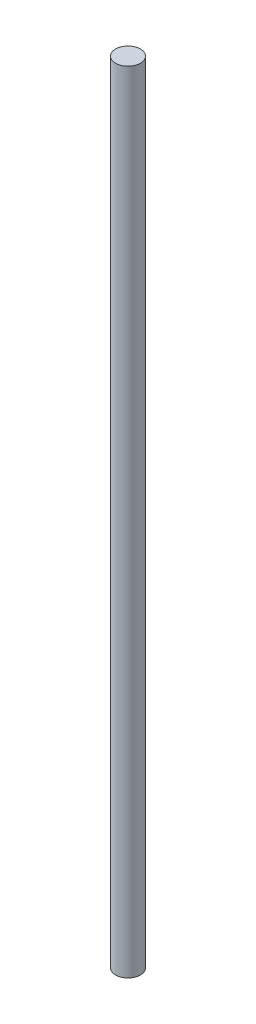
ISO-10303-21;
HEADER;
FILE_DESCRIPTION(('STEP AP214'),'2;1');
FILE_NAME('part.step','',(''),(''),'','','');
FILE_SCHEMA(('AUTOMOTIVE_DESIGN { 1 0 10303 214 1 1 1 1 }'));
ENDSEC;
DATA;
#1=APPLICATION_CONTEXT('core data for automotive mechanical design processes');
#2=APPLICATION_PROTOCOL_DEFINITION('international standard','automotive_design',2000,#1);
#3=PRODUCT_CONTEXT('',#1,'mechanical');
#4=PRODUCT('Part','Part','',(#3));
#5=PRODUCT_RELATED_PRODUCT_CATEGORY('part','',(#4));
#6=PRODUCT_DEFINITION_FORMATION('','',#4);
#7=PRODUCT_DEFINITION_CONTEXT('part definition',#1,'design');
#8=PRODUCT_DEFINITION('design','',#6,#7);
#9=PRODUCT_DEFINITION_SHAPE('','',#8);
#10=(LENGTH_UNIT() NAMED_UNIT(*) SI_UNIT(.MILLI.,.METRE.));
#11=(NAMED_UNIT(*) PLANE_ANGLE_UNIT() SI_UNIT($,.RADIAN.));
#12=(NAMED_UNIT(*) SI_UNIT($,.STERADIAN.) SOLID_ANGLE_UNIT());
#13=UNCERTAINTY_MEASURE_WITH_UNIT(LENGTH_MEASURE(1.E-05),#10,'distance_accuracy_value','');
#14=(GEOMETRIC_REPRESENTATION_CONTEXT(3) GLOBAL_UNCERTAINTY_ASSIGNED_CONTEXT((#13)) GLOBAL_UNIT_ASSIGNED_CONTEXT((#10,
#11,#12)) REPRESENTATION_CONTEXT('',''));
#15=CARTESIAN_POINT('',(0.,0.,0.));
#16=DIRECTION('',(0.,0.,1.));
#17=DIRECTION('',(1.,0.,0.));
#18=AXIS2_PLACEMENT_3D('',#15,#16,#17);
#19=CARTESIAN_POINT('',(0.,255.,0.));
#20=DIRECTION('',(0.,-1.,0.));
#21=DIRECTION('',(0.,0.,-1.));
#22=AXIS2_PLACEMENT_3D('',#19,#20,#21);
#23=CYLINDRICAL_SURFACE('',#22,4.);
#24=CARTESIAN_POINT('',(0.,255.,0.));
#25=DIRECTION('',(0.,1.,0.));
#26=DIRECTION('',(0.,0.,1.));
#27=AXIS2_PLACEMENT_3D('',#24,#25,#26);
#28=CIRCLE('',#27,4.);
#29=CARTESIAN_POINT('',(0.,255.,4.));
#30=VERTEX_POINT('',#29);
#31=EDGE_CURVE('E10',#30,#30,#28,.T.);
#32=ORIENTED_EDGE('',*,*,#31,.F.);
#33=EDGE_LOOP('',(#32));
#34=FACE_BOUND('',#33,.T.);
#35=CARTESIAN_POINT('',(0.,0.,0.));
#36=DIRECTION('',(0.,1.,0.));
#37=DIRECTION('',(0.,0.,1.));
#38=AXIS2_PLACEMENT_3D('',#35,#36,#37);
#39=CIRCLE('',#38,4.);
#40=CARTESIAN_POINT('',(0.,0.,4.));
#41=VERTEX_POINT('',#40);
#42=EDGE_CURVE('E36',#41,#41,#39,.T.);
#43=ORIENTED_EDGE('',*,*,#42,.T.);
#44=EDGE_LOOP('',(#43));
#45=FACE_BOUND('',#44,.T.);
#46=ADVANCED_FACE('F33',(#34,#45),#23,.T.);
#47=CARTESIAN_POINT('',(0.,255.,0.));
#48=DIRECTION('',(0.,1.,0.));
#49=DIRECTION('',(0.,0.,1.));
#50=AXIS2_PLACEMENT_3D('',#47,#48,#49);
#51=PLANE('',#50);
#52=ORIENTED_EDGE('',*,*,#31,.T.);
#53=EDGE_LOOP('',(#52));
#54=FACE_BOUND('',#53,.T.);
#55=ADVANCED_FACE('F48',(#54),#51,.T.);
#56=CARTESIAN_POINT('',(0.,0.,0.));
#57=DIRECTION('',(0.,1.,0.));
#58=DIRECTION('',(0.,0.,1.));
#59=AXIS2_PLACEMENT_3D('',#56,#57,#58);
#60=PLANE('',#59);
#61=ORIENTED_EDGE('',*,*,#42,.F.);
#62=EDGE_LOOP('',(#61));
#63=FACE_BOUND('',#62,.T.);
#64=ADVANCED_FACE('F46',(#63),#60,.F.);
#65=CLOSED_SHELL('',(#46,#55,#64));
#66=MANIFOLD_SOLID_BREP('B2',#65);
#67=ADVANCED_BREP_SHAPE_REPRESENTATION('',(#18,#66),#14);
#68=SHAPE_DEFINITION_REPRESENTATION(#9,#67);
ENDSEC;
END-ISO-10303-21;
